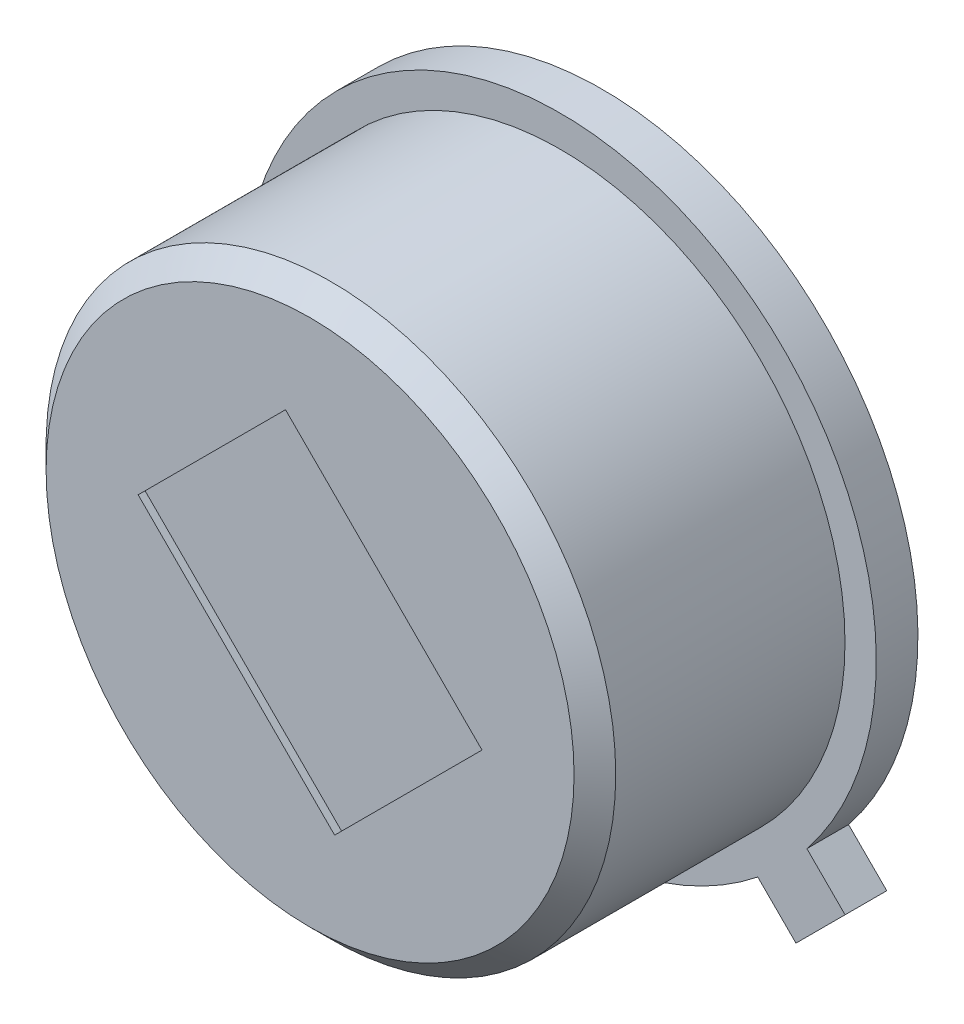
ISO-10303-21;
HEADER;
FILE_DESCRIPTION(('STEP AP214'),'2;1');
FILE_NAME('part.step','',(''),(''),'','','');
FILE_SCHEMA(('AUTOMOTIVE_DESIGN { 1 0 10303 214 1 1 1 1 }'));
ENDSEC;
DATA;
#1=APPLICATION_CONTEXT('core data for automotive mechanical design processes');
#2=APPLICATION_PROTOCOL_DEFINITION('international standard','automotive_design',2000,#1);
#3=PRODUCT_CONTEXT('',#1,'mechanical');
#4=PRODUCT('Part','Part','',(#3));
#5=PRODUCT_RELATED_PRODUCT_CATEGORY('part','',(#4));
#6=PRODUCT_DEFINITION_FORMATION('','',#4);
#7=PRODUCT_DEFINITION_CONTEXT('part definition',#1,'design');
#8=PRODUCT_DEFINITION('design','',#6,#7);
#9=PRODUCT_DEFINITION_SHAPE('','',#8);
#10=(LENGTH_UNIT() NAMED_UNIT(*) SI_UNIT(.MILLI.,.METRE.));
#11=(NAMED_UNIT(*) PLANE_ANGLE_UNIT() SI_UNIT($,.RADIAN.));
#12=(NAMED_UNIT(*) SI_UNIT($,.STERADIAN.) SOLID_ANGLE_UNIT());
#13=UNCERTAINTY_MEASURE_WITH_UNIT(LENGTH_MEASURE(1.E-05),#10,'distance_accuracy_value','');
#14=(GEOMETRIC_REPRESENTATION_CONTEXT(3) GLOBAL_UNCERTAINTY_ASSIGNED_CONTEXT((#13)) GLOBAL_UNIT_ASSIGNED_CONTEXT((#10,
#11,#12)) REPRESENTATION_CONTEXT('',''));
#15=CARTESIAN_POINT('',(0.,0.,0.));
#16=DIRECTION('',(0.,0.,1.));
#17=DIRECTION('',(1.,0.,0.));
#18=AXIS2_PLACEMENT_3D('',#15,#16,#17);
#19=CARTESIAN_POINT('',(0.,0.,4.1));
#20=DIRECTION('',(0.,0.,1.));
#21=DIRECTION('',(1.,0.,0.));
#22=AXIS2_PLACEMENT_3D('',#19,#20,#21);
#23=PLANE('',#22);
#24=DIRECTION('',(0.707106781186548,-0.707106781186548,0.));
#25=VECTOR('',#24,1.);
#26=CARTESIAN_POINT('',(-2.474873734153,0.353553390593,4.1));
#27=LINE('',#26,#25);
#28=CARTESIAN_POINT('',(-2.474873734153,0.353553390593,4.1));
#29=VERTEX_POINT('',#28);
#30=CARTESIAN_POINT('',(0.353553390593,-2.474873734153,4.1));
#31=VERTEX_POINT('',#30);
#32=EDGE_CURVE('E198',#29,#31,#27,.T.);
#33=ORIENTED_EDGE('',*,*,#32,.T.);
#34=DIRECTION('',(0.707106781186548,0.707106781186548,0.));
#35=VECTOR('',#34,1.);
#36=CARTESIAN_POINT('',(0.353553390593,-2.474873734153,4.1));
#37=LINE('',#36,#35);
#38=CARTESIAN_POINT('',(2.474873734153,-0.353553390593,4.1));
#39=VERTEX_POINT('',#38);
#40=EDGE_CURVE('E164',#31,#39,#37,.T.);
#41=ORIENTED_EDGE('',*,*,#40,.T.);
#42=DIRECTION('',(-0.707106781186548,0.707106781186548,0.));
#43=VECTOR('',#42,1.);
#44=CARTESIAN_POINT('',(2.474873734153,-0.353553390593,4.1));
#45=LINE('',#44,#43);
#46=CARTESIAN_POINT('',(-0.353553390593,2.474873734153,4.1));
#47=VERTEX_POINT('',#46);
#48=EDGE_CURVE('E27',#39,#47,#45,.T.);
#49=ORIENTED_EDGE('',*,*,#48,.T.);
#50=DIRECTION('',(-0.707106781186548,-0.707106781186548,0.));
#51=VECTOR('',#50,1.);
#52=CARTESIAN_POINT('',(-0.353553390593,2.474873734153,4.1));
#53=LINE('',#52,#51);
#54=EDGE_CURVE('E11',#47,#29,#53,.T.);
#55=ORIENTED_EDGE('',*,*,#54,.T.);
#56=EDGE_LOOP('',(#33,#41,#49,#55));
#57=FACE_BOUND('',#56,.T.);
#58=ADVANCED_FACE('F17',(#57),#23,.T.);
#59=CARTESIAN_POINT('',(-0.353553390593,2.474873734153,4.1));
#60=DIRECTION('',(0.707106781186548,-0.707106781186548,0.));
#61=DIRECTION('',(0.,0.,-1.));
#62=AXIS2_PLACEMENT_3D('',#59,#60,#61);
#63=PLANE('',#62);
#64=DIRECTION('',(0.,0.,1.));
#65=VECTOR('',#64,1.);
#66=CARTESIAN_POINT('',(-0.353553390593,2.474873734153,4.1));
#67=LINE('',#66,#65);
#68=CARTESIAN_POINT('',(-0.353553390593,2.474873734153,4.2));
#69=VERTEX_POINT('',#68);
#70=EDGE_CURVE('E169',#47,#69,#67,.T.);
#71=ORIENTED_EDGE('',*,*,#70,.T.);
#72=DIRECTION('',(-0.707106781186548,-0.707106781186548,0.));
#73=VECTOR('',#72,1.);
#74=CARTESIAN_POINT('',(-0.353553390593,2.474873734153,4.2));
#75=LINE('',#74,#73);
#76=CARTESIAN_POINT('',(-2.474873734153,0.353553390593,4.2));
#77=VERTEX_POINT('',#76);
#78=EDGE_CURVE('E178',#69,#77,#75,.T.);
#79=ORIENTED_EDGE('',*,*,#78,.T.);
#80=DIRECTION('',(0.,0.,1.));
#81=VECTOR('',#80,1.);
#82=CARTESIAN_POINT('',(-2.474873734153,0.353553390593,4.1));
#83=LINE('',#82,#81);
#84=EDGE_CURVE('E189',#29,#77,#83,.T.);
#85=ORIENTED_EDGE('',*,*,#84,.F.);
#86=ORIENTED_EDGE('',*,*,#54,.F.);
#87=EDGE_LOOP('',(#71,#79,#85,#86));
#88=FACE_BOUND('',#87,.T.);
#89=ADVANCED_FACE('F19',(#88),#63,.T.);
#90=CARTESIAN_POINT('',(2.474873734153,-0.353553390593,4.1));
#91=DIRECTION('',(-0.707106781186548,-0.707106781186548,0.));
#92=DIRECTION('',(-0.707106781186548,0.707106781186548,0.));
#93=AXIS2_PLACEMENT_3D('',#90,#91,#92);
#94=PLANE('',#93);
#95=DIRECTION('',(0.,0.,1.));
#96=VECTOR('',#95,1.);
#97=CARTESIAN_POINT('',(2.474873734153,-0.353553390593,4.1));
#98=LINE('',#97,#96);
#99=CARTESIAN_POINT('',(2.474873734153,-0.353553390593,4.2));
#100=VERTEX_POINT('',#99);
#101=EDGE_CURVE('E166',#39,#100,#98,.T.);
#102=ORIENTED_EDGE('',*,*,#101,.T.);
#103=DIRECTION('',(-0.707106781186548,0.707106781186548,0.));
#104=VECTOR('',#103,1.);
#105=CARTESIAN_POINT('',(2.474873734153,-0.353553390593,4.2));
#106=LINE('',#105,#104);
#107=EDGE_CURVE('E181',#100,#69,#106,.T.);
#108=ORIENTED_EDGE('',*,*,#107,.T.);
#109=ORIENTED_EDGE('',*,*,#70,.F.);
#110=ORIENTED_EDGE('',*,*,#48,.F.);
#111=EDGE_LOOP('',(#102,#108,#109,#110));
#112=FACE_BOUND('',#111,.T.);
#113=ADVANCED_FACE('F207',(#112),#94,.T.);
#114=CARTESIAN_POINT('',(0.353553390593,-2.474873734153,4.1));
#115=DIRECTION('',(-0.707106781186548,0.707106781186548,0.));
#116=DIRECTION('',(0.,0.,1.));
#117=AXIS2_PLACEMENT_3D('',#114,#115,#116);
#118=PLANE('',#117);
#119=DIRECTION('',(0.,0.,1.));
#120=VECTOR('',#119,1.);
#121=CARTESIAN_POINT('',(0.353553390593,-2.474873734153,4.1));
#122=LINE('',#121,#120);
#123=CARTESIAN_POINT('',(0.353553390593,-2.474873734153,4.2));
#124=VERTEX_POINT('',#123);
#125=EDGE_CURVE('E193',#31,#124,#122,.T.);
#126=ORIENTED_EDGE('',*,*,#125,.T.);
#127=DIRECTION('',(0.707106781186548,0.707106781186548,0.));
#128=VECTOR('',#127,1.);
#129=CARTESIAN_POINT('',(0.353553390593,-2.474873734153,4.2));
#130=LINE('',#129,#128);
#131=EDGE_CURVE('E186',#124,#100,#130,.T.);
#132=ORIENTED_EDGE('',*,*,#131,.T.);
#133=ORIENTED_EDGE('',*,*,#101,.F.);
#134=ORIENTED_EDGE('',*,*,#40,.F.);
#135=EDGE_LOOP('',(#126,#132,#133,#134));
#136=FACE_BOUND('',#135,.T.);
#137=ADVANCED_FACE('F222',(#136),#118,.T.);
#138=CARTESIAN_POINT('',(-2.474873734153,0.353553390593,4.1));
#139=DIRECTION('',(0.707106781186548,0.707106781186548,0.));
#140=DIRECTION('',(0.,0.,-1.));
#141=AXIS2_PLACEMENT_3D('',#138,#139,#140);
#142=PLANE('',#141);
#143=ORIENTED_EDGE('',*,*,#84,.T.);
#144=DIRECTION('',(0.707106781186548,-0.707106781186548,0.));
#145=VECTOR('',#144,1.);
#146=CARTESIAN_POINT('',(-2.474873734153,0.353553390593,4.2));
#147=LINE('',#146,#145);
#148=EDGE_CURVE('E173',#77,#124,#147,.T.);
#149=ORIENTED_EDGE('',*,*,#148,.T.);
#150=ORIENTED_EDGE('',*,*,#125,.F.);
#151=ORIENTED_EDGE('',*,*,#32,.F.);
#152=EDGE_LOOP('',(#143,#149,#150,#151));
#153=FACE_BOUND('',#152,.T.);
#154=ADVANCED_FACE('F218',(#153),#142,.T.);
#155=CARTESIAN_POINT('',(0.,0.,4.2));
#156=DIRECTION('',(0.,0.,1.));
#157=DIRECTION('',(1.,0.,0.));
#158=AXIS2_PLACEMENT_3D('',#155,#156,#157);
#159=PLANE('',#158);
#160=ORIENTED_EDGE('',*,*,#148,.F.);
#161=ORIENTED_EDGE('',*,*,#78,.F.);
#162=ORIENTED_EDGE('',*,*,#107,.F.);
#163=ORIENTED_EDGE('',*,*,#131,.F.);
#164=EDGE_LOOP('',(#160,#161,#162,#163));
#165=FACE_BOUND('',#164,.T.);
#166=CARTESIAN_POINT('',(0.,0.,4.2));
#167=DIRECTION('',(0.,0.,1.));
#168=DIRECTION('',(1.,0.,0.));
#169=AXIS2_PLACEMENT_3D('',#166,#167,#168);
#170=CIRCLE('',#169,3.8);
#171=CARTESIAN_POINT('',(3.8,0.,4.2));
#172=VERTEX_POINT('',#171);
#173=EDGE_CURVE('E168',#172,#172,#170,.T.);
#174=ORIENTED_EDGE('',*,*,#173,.T.);
#175=EDGE_LOOP('',(#174));
#176=FACE_BOUND('',#175,.T.);
#177=ADVANCED_FACE('F214',(#165,#176),#159,.T.);
#178=CARTESIAN_POINT('',(0.,0.,3.9));
#179=DIRECTION('',(0.,0.,-1.));
#180=DIRECTION('',(1.,0.,0.));
#181=AXIS2_PLACEMENT_3D('',#178,#179,#180);
#182=CONICAL_SURFACE('',#181,4.1,0.785398163397);
#183=ORIENTED_EDGE('',*,*,#173,.F.);
#184=EDGE_LOOP('',(#183));
#185=FACE_BOUND('',#184,.T.);
#186=CARTESIAN_POINT('',(0.,0.,3.9));
#187=DIRECTION('',(0.,0.,1.));
#188=DIRECTION('',(1.,0.,0.));
#189=AXIS2_PLACEMENT_3D('',#186,#187,#188);
#190=CIRCLE('',#189,4.1);
#191=CARTESIAN_POINT('',(4.1,0.,3.9));
#192=VERTEX_POINT('',#191);
#193=EDGE_CURVE('E140',#192,#192,#190,.T.);
#194=ORIENTED_EDGE('',*,*,#193,.T.);
#195=EDGE_LOOP('',(#194));
#196=FACE_BOUND('',#195,.T.);
#197=ADVANCED_FACE('F269',(#185,#196),#182,.T.);
#198=CARTESIAN_POINT('',(0.,0.,0.6));
#199=DIRECTION('',(0.,0.,-1.));
#200=DIRECTION('',(1.,0.,0.));
#201=AXIS2_PLACEMENT_3D('',#198,#199,#200);
#202=CYLINDRICAL_SURFACE('',#201,4.1);
#203=ORIENTED_EDGE('',*,*,#193,.F.);
#204=EDGE_LOOP('',(#203));
#205=FACE_BOUND('',#204,.T.);
#206=CARTESIAN_POINT('',(0.,0.,0.6));
#207=DIRECTION('',(0.,0.,1.));
#208=DIRECTION('',(1.,0.,0.));
#209=AXIS2_PLACEMENT_3D('',#206,#207,#208);
#210=CIRCLE('',#209,4.1);
#211=CARTESIAN_POINT('',(4.1,0.,0.6));
#212=VERTEX_POINT('',#211);
#213=EDGE_CURVE('E146',#212,#212,#210,.T.);
#214=ORIENTED_EDGE('',*,*,#213,.T.);
#215=EDGE_LOOP('',(#214));
#216=FACE_BOUND('',#215,.T.);
#217=ADVANCED_FACE('F278',(#205,#216),#202,.T.);
#218=CARTESIAN_POINT('',(3.394112549695,-4.101219330882,0.));
#219=DIRECTION('',(-0.707106781186548,0.707106781186548,0.));
#220=DIRECTION('',(0.,0.,1.));
#221=AXIS2_PLACEMENT_3D('',#218,#219,#220);
#222=PLANE('',#221);
#223=DIRECTION('',(0.707106781186548,0.707106781186548,0.));
#224=VECTOR('',#223,1.);
#225=CARTESIAN_POINT('',(3.394112549695,-4.101219330882,0.));
#226=LINE('',#225,#224);
#227=CARTESIAN_POINT('',(3.394112549695,-4.101219330882,0.));
#228=VERTEX_POINT('',#227);
#229=CARTESIAN_POINT('',(4.101219330882,-3.394112549695,0.));
#230=VERTEX_POINT('',#229);
#231=EDGE_CURVE('E144',#228,#230,#226,.T.);
#232=ORIENTED_EDGE('',*,*,#231,.T.);
#233=DIRECTION('',(0.,0.,1.));
#234=VECTOR('',#233,1.);
#235=CARTESIAN_POINT('',(4.101219330882,-3.394112549695,0.));
#236=LINE('',#235,#234);
#237=CARTESIAN_POINT('',(4.101219330882,-3.394112549695,0.6));
#238=VERTEX_POINT('',#237);
#239=EDGE_CURVE('E114',#230,#238,#236,.T.);
#240=ORIENTED_EDGE('',*,*,#239,.T.);
#241=DIRECTION('',(0.707106781186548,0.707106781186548,0.));
#242=VECTOR('',#241,1.);
#243=CARTESIAN_POINT('',(3.394112549695,-4.101219330882,0.6));
#244=LINE('',#243,#242);
#245=CARTESIAN_POINT('',(3.394112549695,-4.101219330882,0.6));
#246=VERTEX_POINT('',#245);
#247=EDGE_CURVE('E115',#246,#238,#244,.T.);
#248=ORIENTED_EDGE('',*,*,#247,.F.);
#249=DIRECTION('',(0.,0.,1.));
#250=VECTOR('',#249,1.);
#251=CARTESIAN_POINT('',(3.394112549695,-4.101219330882,0.));
#252=LINE('',#251,#250);
#253=EDGE_CURVE('E107',#228,#246,#252,.T.);
#254=ORIENTED_EDGE('',*,*,#253,.F.);
#255=EDGE_LOOP('',(#232,#240,#248,#254));
#256=FACE_BOUND('',#255,.T.);
#257=ADVANCED_FACE('F295',(#256),#222,.F.);
#258=CARTESIAN_POINT('',(-0.353553390593,-0.353553390593,0.));
#259=DIRECTION('',(0.707106781186548,0.707106781186548,0.));
#260=DIRECTION('',(0.,0.,-1.));
#261=AXIS2_PLACEMENT_3D('',#258,#259,#260);
#262=PLANE('',#261);
#263=ORIENTED_EDGE('',*,*,#253,.T.);
#264=DIRECTION('',(0.707106781186548,-0.707106781186548,0.));
#265=VECTOR('',#264,1.);
#266=CARTESIAN_POINT('',(-0.353553390593,-0.353553390593,0.6));
#267=LINE('',#266,#265);
#268=CARTESIAN_POINT('',(2.844297450206,-3.551404231392,0.6));
#269=VERTEX_POINT('',#268);
#270=EDGE_CURVE('E105',#269,#246,#267,.T.);
#271=ORIENTED_EDGE('',*,*,#270,.F.);
#272=DIRECTION('',(0.,0.,-1.));
#273=VECTOR('',#272,1.);
#274=CARTESIAN_POINT('',(2.844297450206,-3.551404231392,0.));
#275=LINE('',#274,#273);
#276=CARTESIAN_POINT('',(2.844297450206,-3.551404231392,0.));
#277=VERTEX_POINT('',#276);
#278=EDGE_CURVE('E110',#269,#277,#275,.T.);
#279=ORIENTED_EDGE('',*,*,#278,.T.);
#280=DIRECTION('',(0.707106781186548,-0.707106781186548,0.));
#281=VECTOR('',#280,1.);
#282=CARTESIAN_POINT('',(-0.353553390593,-0.353553390593,0.));
#283=LINE('',#282,#281);
#284=EDGE_CURVE('E152',#277,#228,#283,.T.);
#285=ORIENTED_EDGE('',*,*,#284,.T.);
#286=EDGE_LOOP('',(#263,#271,#279,#285));
#287=FACE_BOUND('',#286,.T.);
#288=ADVANCED_FACE('F102',(#287),#262,.F.);
#289=CARTESIAN_POINT('',(0.,0.,0.6));
#290=DIRECTION('',(0.,0.,1.));
#291=DIRECTION('',(1.,0.,0.));
#292=AXIS2_PLACEMENT_3D('',#289,#290,#291);
#293=PLANE('',#292);
#294=ORIENTED_EDGE('',*,*,#213,.F.);
#295=EDGE_LOOP('',(#294));
#296=FACE_BOUND('',#295,.T.);
#297=CARTESIAN_POINT('',(0.,0.,0.6));
#298=DIRECTION('',(0.,0.,-1.));
#299=DIRECTION('',(0.625120318726752,-0.780528402503691,0.));
#300=AXIS2_PLACEMENT_3D('',#297,#298,#299);
#301=CIRCLE('',#300,4.55);
#302=CARTESIAN_POINT('',(3.551404231392,-2.844297450206,0.6));
#303=VERTEX_POINT('',#302);
#304=EDGE_CURVE('E116',#269,#303,#301,.T.);
#305=ORIENTED_EDGE('',*,*,#304,.F.);
#306=ORIENTED_EDGE('',*,*,#270,.T.);
#307=ORIENTED_EDGE('',*,*,#247,.T.);
#308=DIRECTION('',(-0.707106781186548,0.707106781186548,0.));
#309=VECTOR('',#308,1.);
#310=CARTESIAN_POINT('',(4.101219330882,-3.394112549695,0.6));
#311=LINE('',#310,#309);
#312=EDGE_CURVE('E118',#238,#303,#311,.T.);
#313=ORIENTED_EDGE('',*,*,#312,.T.);
#314=EDGE_LOOP('',(#305,#306,#307,#313));
#315=FACE_BOUND('',#314,.T.);
#316=ADVANCED_FACE('F117',(#296,#315),#293,.T.);
#317=CARTESIAN_POINT('',(4.101219330882,-3.394112549695,0.));
#318=DIRECTION('',(-0.707106781186548,-0.707106781186548,0.));
#319=DIRECTION('',(-0.707106781186548,0.707106781186548,0.));
#320=AXIS2_PLACEMENT_3D('',#317,#318,#319);
#321=PLANE('',#320);
#322=DIRECTION('',(0.,0.,-1.));
#323=VECTOR('',#322,1.);
#324=CARTESIAN_POINT('',(3.551404231392,-2.844297450206,0.));
#325=LINE('',#324,#323);
#326=CARTESIAN_POINT('',(3.551404231392,-2.844297450206,0.));
#327=VERTEX_POINT('',#326);
#328=EDGE_CURVE('E122',#303,#327,#325,.T.);
#329=ORIENTED_EDGE('',*,*,#328,.F.);
#330=ORIENTED_EDGE('',*,*,#312,.F.);
#331=ORIENTED_EDGE('',*,*,#239,.F.);
#332=DIRECTION('',(-0.707106781186548,0.707106781186548,0.));
#333=VECTOR('',#332,1.);
#334=CARTESIAN_POINT('',(4.101219330882,-3.394112549695,0.));
#335=LINE('',#334,#333);
#336=EDGE_CURVE('E142',#230,#327,#335,.T.);
#337=ORIENTED_EDGE('',*,*,#336,.T.);
#338=EDGE_LOOP('',(#329,#330,#331,#337));
#339=FACE_BOUND('',#338,.T.);
#340=ADVANCED_FACE('F321',(#339),#321,.F.);
#341=CARTESIAN_POINT('',(0.,0.,0.));
#342=DIRECTION('',(0.,0.,1.));
#343=DIRECTION('',(1.,0.,0.));
#344=AXIS2_PLACEMENT_3D('',#341,#342,#343);
#345=PLANE('',#344);
#346=ORIENTED_EDGE('',*,*,#336,.F.);
#347=ORIENTED_EDGE('',*,*,#231,.F.);
#348=ORIENTED_EDGE('',*,*,#284,.F.);
#349=CARTESIAN_POINT('',(0.,0.,0.));
#350=DIRECTION('',(0.,0.,1.));
#351=DIRECTION('',(0.780528402503691,-0.625120318726752,0.));
#352=AXIS2_PLACEMENT_3D('',#349,#350,#351);
#353=CIRCLE('',#352,4.55);
#354=EDGE_CURVE('E127',#327,#277,#353,.T.);
#355=ORIENTED_EDGE('',*,*,#354,.F.);
#356=EDGE_LOOP('',(#346,#347,#348,#355));
#357=FACE_BOUND('',#356,.T.);
#358=ADVANCED_FACE('F335',(#357),#345,.F.);
#359=CARTESIAN_POINT('',(0.,0.,0.));
#360=DIRECTION('',(0.,0.,-1.));
#361=DIRECTION('',(1.,0.,0.));
#362=AXIS2_PLACEMENT_3D('',#359,#360,#361);
#363=CYLINDRICAL_SURFACE('',#362,4.55);
#364=ORIENTED_EDGE('',*,*,#278,.F.);
#365=ORIENTED_EDGE('',*,*,#304,.T.);
#366=ORIENTED_EDGE('',*,*,#328,.T.);
#367=ORIENTED_EDGE('',*,*,#354,.T.);
#368=EDGE_LOOP('',(#364,#365,#366,#367));
#369=FACE_BOUND('',#368,.T.);
#370=ADVANCED_FACE('F126',(#369),#363,.T.);
#371=CLOSED_SHELL('',(#58,#89,#113,#137,#154,#177,#197,#217,#257,#288,#316,#340,#358,#370));
#372=MANIFOLD_SOLID_BREP('B1',#371);
#373=ADVANCED_BREP_SHAPE_REPRESENTATION('',(#18,#372),#14);
#374=SHAPE_DEFINITION_REPRESENTATION(#9,#373);
ENDSEC;
END-ISO-10303-21;
